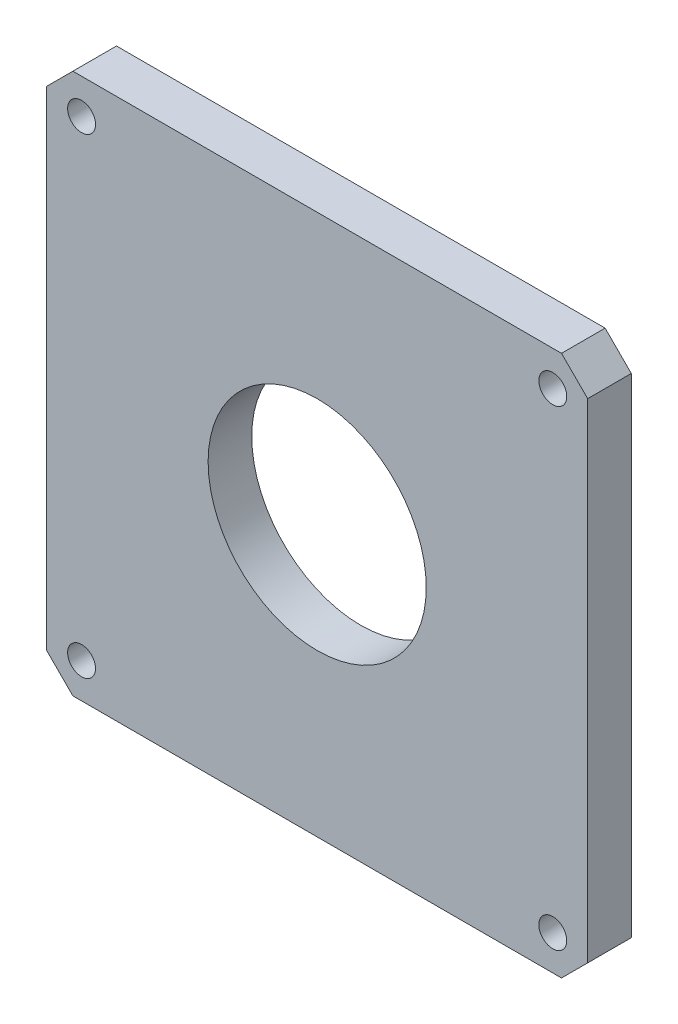
ISO-10303-21;
HEADER;
FILE_DESCRIPTION(('STEP AP214'),'2;1');
FILE_NAME('part.step','',(''),(''),'','','');
FILE_SCHEMA(('AUTOMOTIVE_DESIGN { 1 0 10303 214 1 1 1 1 }'));
ENDSEC;
DATA;
#1=APPLICATION_CONTEXT('core data for automotive mechanical design processes');
#2=APPLICATION_PROTOCOL_DEFINITION('international standard','automotive_design',2000,#1);
#3=PRODUCT_CONTEXT('',#1,'mechanical');
#4=PRODUCT('Part','Part','',(#3));
#5=PRODUCT_RELATED_PRODUCT_CATEGORY('part','',(#4));
#6=PRODUCT_DEFINITION_FORMATION('','',#4);
#7=PRODUCT_DEFINITION_CONTEXT('part definition',#1,'design');
#8=PRODUCT_DEFINITION('design','',#6,#7);
#9=PRODUCT_DEFINITION_SHAPE('','',#8);
#10=(LENGTH_UNIT() NAMED_UNIT(*) SI_UNIT(.MILLI.,.METRE.));
#11=(NAMED_UNIT(*) PLANE_ANGLE_UNIT() SI_UNIT($,.RADIAN.));
#12=(NAMED_UNIT(*) SI_UNIT($,.STERADIAN.) SOLID_ANGLE_UNIT());
#13=UNCERTAINTY_MEASURE_WITH_UNIT(LENGTH_MEASURE(1.E-05),#10,'distance_accuracy_value','');
#14=(GEOMETRIC_REPRESENTATION_CONTEXT(3) GLOBAL_UNCERTAINTY_ASSIGNED_CONTEXT((#13)) GLOBAL_UNIT_ASSIGNED_CONTEXT((#10,
#11,#12)) REPRESENTATION_CONTEXT('',''));
#15=CARTESIAN_POINT('',(0.,0.,0.));
#16=DIRECTION('',(0.,0.,1.));
#17=DIRECTION('',(1.,0.,0.));
#18=AXIS2_PLACEMENT_3D('',#15,#16,#17);
#19=CARTESIAN_POINT('',(0.,0.,5.));
#20=DIRECTION('',(0.,0.,1.));
#21=DIRECTION('',(1.,0.,0.));
#22=AXIS2_PLACEMENT_3D('',#19,#20,#21);
#23=PLANE('',#22);
#24=CARTESIAN_POINT('',(-27.,27.,5.));
#25=DIRECTION('',(0.,0.,1.));
#26=DIRECTION('',(-1.,0.,0.));
#27=AXIS2_PLACEMENT_3D('',#24,#25,#26);
#28=CIRCLE('',#27,1.6);
#29=CARTESIAN_POINT('',(-28.6,27.,5.));
#30=VERTEX_POINT('',#29);
#31=EDGE_CURVE('E193',#30,#30,#28,.T.);
#32=ORIENTED_EDGE('',*,*,#31,.F.);
#33=EDGE_LOOP('',(#32));
#34=FACE_BOUND('',#33,.T.);
#35=CARTESIAN_POINT('',(27.,-27.,5.));
#36=DIRECTION('',(0.,0.,1.));
#37=DIRECTION('',(-1.,0.,0.));
#38=AXIS2_PLACEMENT_3D('',#35,#36,#37);
#39=CIRCLE('',#38,1.6);
#40=CARTESIAN_POINT('',(25.4,-27.,5.));
#41=VERTEX_POINT('',#40);
#42=EDGE_CURVE('E199',#41,#41,#39,.T.);
#43=ORIENTED_EDGE('',*,*,#42,.F.);
#44=EDGE_LOOP('',(#43));
#45=FACE_BOUND('',#44,.T.);
#46=CARTESIAN_POINT('',(-27.,-27.,5.));
#47=DIRECTION('',(0.,0.,1.));
#48=DIRECTION('',(1.,0.,0.));
#49=AXIS2_PLACEMENT_3D('',#46,#47,#48);
#50=CIRCLE('',#49,1.6);
#51=CARTESIAN_POINT('',(-25.4,-27.,5.));
#52=VERTEX_POINT('',#51);
#53=EDGE_CURVE('E200',#52,#52,#50,.T.);
#54=ORIENTED_EDGE('',*,*,#53,.F.);
#55=EDGE_LOOP('',(#54));
#56=FACE_BOUND('',#55,.T.);
#57=CARTESIAN_POINT('',(27.,27.,5.));
#58=DIRECTION('',(0.,0.,1.));
#59=DIRECTION('',(1.,0.,0.));
#60=AXIS2_PLACEMENT_3D('',#57,#58,#59);
#61=CIRCLE('',#60,1.6);
#62=CARTESIAN_POINT('',(28.6,27.,5.));
#63=VERTEX_POINT('',#62);
#64=EDGE_CURVE('E190',#63,#63,#61,.T.);
#65=ORIENTED_EDGE('',*,*,#64,.F.);
#66=EDGE_LOOP('',(#65));
#67=FACE_BOUND('',#66,.T.);
#68=DIRECTION('',(1.,0.,0.));
#69=VECTOR('',#68,1.);
#70=CARTESIAN_POINT('',(-31.,-31.,5.));
#71=LINE('',#70,#69);
#72=CARTESIAN_POINT('',(-28.,-31.,5.));
#73=VERTEX_POINT('',#72);
#74=CARTESIAN_POINT('',(28.,-31.,5.));
#75=VERTEX_POINT('',#74);
#76=EDGE_CURVE('E174',#73,#75,#71,.T.);
#77=ORIENTED_EDGE('',*,*,#76,.T.);
#78=DIRECTION('',(-0.707106781186548,-0.707106781186547,0.));
#79=VECTOR('',#78,1.);
#80=CARTESIAN_POINT('',(29.5,-29.5,5.));
#81=LINE('',#80,#79);
#82=CARTESIAN_POINT('',(31.,-28.,5.));
#83=VERTEX_POINT('',#82);
#84=EDGE_CURVE('E155',#75,#83,#81,.F.);
#85=ORIENTED_EDGE('',*,*,#84,.T.);
#86=DIRECTION('',(0.,1.,0.));
#87=VECTOR('',#86,1.);
#88=CARTESIAN_POINT('',(31.,31.,5.));
#89=LINE('',#88,#87);
#90=CARTESIAN_POINT('',(31.,28.,5.));
#91=VERTEX_POINT('',#90);
#92=EDGE_CURVE('E125',#83,#91,#89,.T.);
#93=ORIENTED_EDGE('',*,*,#92,.T.);
#94=DIRECTION('',(0.707106781186547,-0.707106781186548,0.));
#95=VECTOR('',#94,1.);
#96=CARTESIAN_POINT('',(29.5,29.5,5.));
#97=LINE('',#96,#95);
#98=CARTESIAN_POINT('',(28.,31.,5.));
#99=VERTEX_POINT('',#98);
#100=EDGE_CURVE('E61',#91,#99,#97,.F.);
#101=ORIENTED_EDGE('',*,*,#100,.T.);
#102=DIRECTION('',(-1.,0.,0.));
#103=VECTOR('',#102,1.);
#104=CARTESIAN_POINT('',(-31.,31.,5.));
#105=LINE('',#104,#103);
#106=CARTESIAN_POINT('',(-28.,31.,5.));
#107=VERTEX_POINT('',#106);
#108=EDGE_CURVE('E141',#99,#107,#105,.T.);
#109=ORIENTED_EDGE('',*,*,#108,.T.);
#110=DIRECTION('',(0.707106781186548,0.707106781186547,0.));
#111=VECTOR('',#110,1.);
#112=CARTESIAN_POINT('',(-29.5,29.5,5.));
#113=LINE('',#112,#111);
#114=CARTESIAN_POINT('',(-31.,28.,5.));
#115=VERTEX_POINT('',#114);
#116=EDGE_CURVE('E152',#107,#115,#113,.F.);
#117=ORIENTED_EDGE('',*,*,#116,.T.);
#118=DIRECTION('',(0.,-1.,0.));
#119=VECTOR('',#118,1.);
#120=CARTESIAN_POINT('',(-31.,31.,5.));
#121=LINE('',#120,#119);
#122=CARTESIAN_POINT('',(-31.,-28.,5.));
#123=VERTEX_POINT('',#122);
#124=EDGE_CURVE('E135',#115,#123,#121,.T.);
#125=ORIENTED_EDGE('',*,*,#124,.T.);
#126=DIRECTION('',(-0.707106781186547,0.707106781186548,0.));
#127=VECTOR('',#126,1.);
#128=CARTESIAN_POINT('',(-29.5,-29.5,5.));
#129=LINE('',#128,#127);
#130=EDGE_CURVE('E150',#123,#73,#129,.F.);
#131=ORIENTED_EDGE('',*,*,#130,.T.);
#132=EDGE_LOOP('',(#77,#85,#93,#101,#109,#117,#125,#131));
#133=FACE_BOUND('',#132,.T.);
#134=CARTESIAN_POINT('',(0.,0.,5.));
#135=DIRECTION('',(0.,0.,1.));
#136=DIRECTION('',(1.,0.,0.));
#137=AXIS2_PLACEMENT_3D('',#134,#135,#136);
#138=CIRCLE('',#137,12.5);
#139=CARTESIAN_POINT('',(12.5,0.,5.));
#140=VERTEX_POINT('',#139);
#141=EDGE_CURVE('E179',#140,#140,#138,.T.);
#142=ORIENTED_EDGE('',*,*,#141,.F.);
#143=EDGE_LOOP('',(#142));
#144=FACE_BOUND('',#143,.T.);
#145=ADVANCED_FACE('F38',(#34,#45,#56,#67,#133,#144),#23,.T.);
#146=CARTESIAN_POINT('',(0.,0.,0.));
#147=DIRECTION('',(0.,0.,1.));
#148=DIRECTION('',(1.,0.,0.));
#149=AXIS2_PLACEMENT_3D('',#146,#147,#148);
#150=PLANE('',#149);
#151=CARTESIAN_POINT('',(-27.,27.,0.));
#152=DIRECTION('',(0.,0.,1.));
#153=DIRECTION('',(-1.,0.,0.));
#154=AXIS2_PLACEMENT_3D('',#151,#152,#153);
#155=CIRCLE('',#154,1.6);
#156=CARTESIAN_POINT('',(-28.6,27.,0.));
#157=VERTEX_POINT('',#156);
#158=EDGE_CURVE('E203',#157,#157,#155,.T.);
#159=ORIENTED_EDGE('',*,*,#158,.T.);
#160=EDGE_LOOP('',(#159));
#161=FACE_BOUND('',#160,.T.);
#162=CARTESIAN_POINT('',(27.,-27.,0.));
#163=DIRECTION('',(0.,0.,1.));
#164=DIRECTION('',(-1.,0.,0.));
#165=AXIS2_PLACEMENT_3D('',#162,#163,#164);
#166=CIRCLE('',#165,1.6);
#167=CARTESIAN_POINT('',(25.4,-27.,0.));
#168=VERTEX_POINT('',#167);
#169=EDGE_CURVE('E196',#168,#168,#166,.T.);
#170=ORIENTED_EDGE('',*,*,#169,.T.);
#171=EDGE_LOOP('',(#170));
#172=FACE_BOUND('',#171,.T.);
#173=CARTESIAN_POINT('',(-27.,-27.,0.));
#174=DIRECTION('',(0.,0.,1.));
#175=DIRECTION('',(1.,0.,0.));
#176=AXIS2_PLACEMENT_3D('',#173,#174,#175);
#177=CIRCLE('',#176,1.6);
#178=CARTESIAN_POINT('',(-25.4,-27.,0.));
#179=VERTEX_POINT('',#178);
#180=EDGE_CURVE('E208',#179,#179,#177,.T.);
#181=ORIENTED_EDGE('',*,*,#180,.T.);
#182=EDGE_LOOP('',(#181));
#183=FACE_BOUND('',#182,.T.);
#184=CARTESIAN_POINT('',(27.,27.,0.));
#185=DIRECTION('',(0.,0.,1.));
#186=DIRECTION('',(1.,0.,0.));
#187=AXIS2_PLACEMENT_3D('',#184,#185,#186);
#188=CIRCLE('',#187,1.6);
#189=CARTESIAN_POINT('',(28.6,27.,0.));
#190=VERTEX_POINT('',#189);
#191=EDGE_CURVE('E188',#190,#190,#188,.T.);
#192=ORIENTED_EDGE('',*,*,#191,.T.);
#193=EDGE_LOOP('',(#192));
#194=FACE_BOUND('',#193,.T.);
#195=DIRECTION('',(0.,1.,0.));
#196=VECTOR('',#195,1.);
#197=CARTESIAN_POINT('',(31.,31.,0.));
#198=LINE('',#197,#196);
#199=CARTESIAN_POINT('',(31.,-28.,0.));
#200=VERTEX_POINT('',#199);
#201=CARTESIAN_POINT('',(31.,28.,0.));
#202=VERTEX_POINT('',#201);
#203=EDGE_CURVE('E123',#200,#202,#198,.T.);
#204=ORIENTED_EDGE('',*,*,#203,.F.);
#205=DIRECTION('',(0.707106781186548,0.707106781186547,0.));
#206=VECTOR('',#205,1.);
#207=CARTESIAN_POINT('',(31.,-28.,0.));
#208=LINE('',#207,#206);
#209=CARTESIAN_POINT('',(28.,-31.,0.));
#210=VERTEX_POINT('',#209);
#211=EDGE_CURVE('E106',#200,#210,#208,.F.);
#212=ORIENTED_EDGE('',*,*,#211,.T.);
#213=DIRECTION('',(1.,0.,0.));
#214=VECTOR('',#213,1.);
#215=CARTESIAN_POINT('',(-31.,-31.,0.));
#216=LINE('',#215,#214);
#217=CARTESIAN_POINT('',(-28.,-31.,0.));
#218=VERTEX_POINT('',#217);
#219=EDGE_CURVE('E133',#218,#210,#216,.T.);
#220=ORIENTED_EDGE('',*,*,#219,.F.);
#221=DIRECTION('',(0.707106781186547,-0.707106781186548,0.));
#222=VECTOR('',#221,1.);
#223=CARTESIAN_POINT('',(-28.,-31.,0.));
#224=LINE('',#223,#222);
#225=CARTESIAN_POINT('',(-31.,-28.,0.));
#226=VERTEX_POINT('',#225);
#227=EDGE_CURVE('E126',#218,#226,#224,.F.);
#228=ORIENTED_EDGE('',*,*,#227,.T.);
#229=DIRECTION('',(0.,-1.,0.));
#230=VECTOR('',#229,1.);
#231=CARTESIAN_POINT('',(-31.,31.,0.));
#232=LINE('',#231,#230);
#233=CARTESIAN_POINT('',(-31.,28.,0.));
#234=VERTEX_POINT('',#233);
#235=EDGE_CURVE('E137',#234,#226,#232,.T.);
#236=ORIENTED_EDGE('',*,*,#235,.F.);
#237=DIRECTION('',(-0.707106781186548,-0.707106781186547,0.));
#238=VECTOR('',#237,1.);
#239=CARTESIAN_POINT('',(-31.,28.,0.));
#240=LINE('',#239,#238);
#241=CARTESIAN_POINT('',(-28.,31.,0.));
#242=VERTEX_POINT('',#241);
#243=EDGE_CURVE('E144',#234,#242,#240,.F.);
#244=ORIENTED_EDGE('',*,*,#243,.T.);
#245=DIRECTION('',(-1.,0.,0.));
#246=VECTOR('',#245,1.);
#247=CARTESIAN_POINT('',(-31.,31.,0.));
#248=LINE('',#247,#246);
#249=CARTESIAN_POINT('',(28.,31.,0.));
#250=VERTEX_POINT('',#249);
#251=EDGE_CURVE('E132',#250,#242,#248,.T.);
#252=ORIENTED_EDGE('',*,*,#251,.F.);
#253=DIRECTION('',(-0.707106781186547,0.707106781186548,0.));
#254=VECTOR('',#253,1.);
#255=CARTESIAN_POINT('',(28.,31.,0.));
#256=LINE('',#255,#254);
#257=EDGE_CURVE('E117',#250,#202,#256,.F.);
#258=ORIENTED_EDGE('',*,*,#257,.T.);
#259=EDGE_LOOP('',(#204,#212,#220,#228,#236,#244,#252,#258));
#260=FACE_BOUND('',#259,.T.);
#261=CARTESIAN_POINT('',(0.,0.,0.));
#262=DIRECTION('',(0.,0.,1.));
#263=DIRECTION('',(1.,0.,0.));
#264=AXIS2_PLACEMENT_3D('',#261,#262,#263);
#265=CIRCLE('',#264,12.5);
#266=CARTESIAN_POINT('',(12.5,0.,0.));
#267=VERTEX_POINT('',#266);
#268=EDGE_CURVE('E181',#267,#267,#265,.T.);
#269=ORIENTED_EDGE('',*,*,#268,.T.);
#270=EDGE_LOOP('',(#269));
#271=FACE_BOUND('',#270,.T.);
#272=ADVANCED_FACE('F129',(#161,#172,#183,#194,#260,#271),#150,.F.);
#273=CARTESIAN_POINT('',(-31.,31.,5.));
#274=DIRECTION('',(1.,0.,0.));
#275=DIRECTION('',(0.,0.,-1.));
#276=AXIS2_PLACEMENT_3D('',#273,#274,#275);
#277=PLANE('',#276);
#278=ORIENTED_EDGE('',*,*,#124,.F.);
#279=DIRECTION('',(0.,0.,-1.));
#280=VECTOR('',#279,1.);
#281=CARTESIAN_POINT('',(-31.,28.,5.));
#282=LINE('',#281,#280);
#283=EDGE_CURVE('E11',#115,#234,#282,.T.);
#284=ORIENTED_EDGE('',*,*,#283,.T.);
#285=ORIENTED_EDGE('',*,*,#235,.T.);
#286=DIRECTION('',(0.,0.,1.));
#287=VECTOR('',#286,1.);
#288=CARTESIAN_POINT('',(-31.,-28.,5.));
#289=LINE('',#288,#287);
#290=EDGE_CURVE('E47',#226,#123,#289,.T.);
#291=ORIENTED_EDGE('',*,*,#290,.T.);
#292=EDGE_LOOP('',(#278,#284,#285,#291));
#293=FACE_BOUND('',#292,.T.);
#294=ADVANCED_FACE('F165',(#293),#277,.F.);
#295=CARTESIAN_POINT('',(-31.,-31.,5.));
#296=DIRECTION('',(0.,1.,0.));
#297=DIRECTION('',(0.,0.,1.));
#298=AXIS2_PLACEMENT_3D('',#295,#296,#297);
#299=PLANE('',#298);
#300=ORIENTED_EDGE('',*,*,#219,.T.);
#301=DIRECTION('',(0.,0.,1.));
#302=VECTOR('',#301,1.);
#303=CARTESIAN_POINT('',(28.,-31.,5.));
#304=LINE('',#303,#302);
#305=EDGE_CURVE('E111',#210,#75,#304,.T.);
#306=ORIENTED_EDGE('',*,*,#305,.T.);
#307=ORIENTED_EDGE('',*,*,#76,.F.);
#308=DIRECTION('',(0.,0.,-1.));
#309=VECTOR('',#308,1.);
#310=CARTESIAN_POINT('',(-28.,-31.,5.));
#311=LINE('',#310,#309);
#312=EDGE_CURVE('E116',#73,#218,#311,.T.);
#313=ORIENTED_EDGE('',*,*,#312,.T.);
#314=EDGE_LOOP('',(#300,#306,#307,#313));
#315=FACE_BOUND('',#314,.T.);
#316=ADVANCED_FACE('F178',(#315),#299,.F.);
#317=CARTESIAN_POINT('',(31.,31.,5.));
#318=DIRECTION('',(-1.,0.,0.));
#319=DIRECTION('',(0.,0.,1.));
#320=AXIS2_PLACEMENT_3D('',#317,#318,#319);
#321=PLANE('',#320);
#322=ORIENTED_EDGE('',*,*,#92,.F.);
#323=DIRECTION('',(0.,0.,-1.));
#324=VECTOR('',#323,1.);
#325=CARTESIAN_POINT('',(31.,-28.,5.));
#326=LINE('',#325,#324);
#327=EDGE_CURVE('E110',#83,#200,#326,.T.);
#328=ORIENTED_EDGE('',*,*,#327,.T.);
#329=ORIENTED_EDGE('',*,*,#203,.T.);
#330=DIRECTION('',(0.,0.,1.));
#331=VECTOR('',#330,1.);
#332=CARTESIAN_POINT('',(31.,28.,5.));
#333=LINE('',#332,#331);
#334=EDGE_CURVE('E127',#202,#91,#333,.T.);
#335=ORIENTED_EDGE('',*,*,#334,.T.);
#336=EDGE_LOOP('',(#322,#328,#329,#335));
#337=FACE_BOUND('',#336,.T.);
#338=ADVANCED_FACE('F122',(#337),#321,.F.);
#339=CARTESIAN_POINT('',(-31.,31.,5.));
#340=DIRECTION('',(0.,-1.,0.));
#341=DIRECTION('',(0.,0.,-1.));
#342=AXIS2_PLACEMENT_3D('',#339,#340,#341);
#343=PLANE('',#342);
#344=ORIENTED_EDGE('',*,*,#108,.F.);
#345=DIRECTION('',(0.,0.,-1.));
#346=VECTOR('',#345,1.);
#347=CARTESIAN_POINT('',(28.,31.,5.));
#348=LINE('',#347,#346);
#349=EDGE_CURVE('E158',#99,#250,#348,.T.);
#350=ORIENTED_EDGE('',*,*,#349,.T.);
#351=ORIENTED_EDGE('',*,*,#251,.T.);
#352=DIRECTION('',(0.,0.,1.));
#353=VECTOR('',#352,1.);
#354=CARTESIAN_POINT('',(-28.,31.,5.));
#355=LINE('',#354,#353);
#356=EDGE_CURVE('E54',#242,#107,#355,.T.);
#357=ORIENTED_EDGE('',*,*,#356,.T.);
#358=EDGE_LOOP('',(#344,#350,#351,#357));
#359=FACE_BOUND('',#358,.T.);
#360=ADVANCED_FACE('F240',(#359),#343,.F.);
#361=CARTESIAN_POINT('',(0.,0.,5.));
#362=DIRECTION('',(0.,0.,-1.));
#363=DIRECTION('',(-1.,0.,0.));
#364=AXIS2_PLACEMENT_3D('',#361,#362,#363);
#365=CYLINDRICAL_SURFACE('',#364,12.5);
#366=ORIENTED_EDGE('',*,*,#141,.T.);
#367=EDGE_LOOP('',(#366));
#368=FACE_BOUND('',#367,.T.);
#369=ORIENTED_EDGE('',*,*,#268,.F.);
#370=EDGE_LOOP('',(#369));
#371=FACE_BOUND('',#370,.T.);
#372=ADVANCED_FACE('F238',(#368,#371),#365,.F.);
#373=CARTESIAN_POINT('',(31.,-28.,5.));
#374=DIRECTION('',(-0.707106781186547,0.707106781186548,0.));
#375=DIRECTION('',(0.,0.,-1.));
#376=AXIS2_PLACEMENT_3D('',#373,#374,#375);
#377=PLANE('',#376);
#378=ORIENTED_EDGE('',*,*,#84,.F.);
#379=ORIENTED_EDGE('',*,*,#305,.F.);
#380=ORIENTED_EDGE('',*,*,#211,.F.);
#381=ORIENTED_EDGE('',*,*,#327,.F.);
#382=EDGE_LOOP('',(#378,#379,#380,#381));
#383=FACE_BOUND('',#382,.T.);
#384=ADVANCED_FACE('F109',(#383),#377,.F.);
#385=CARTESIAN_POINT('',(28.,31.,5.));
#386=DIRECTION('',(-0.707106781186548,-0.707106781186547,0.));
#387=DIRECTION('',(0.,0.,-1.));
#388=AXIS2_PLACEMENT_3D('',#385,#386,#387);
#389=PLANE('',#388);
#390=ORIENTED_EDGE('',*,*,#100,.F.);
#391=ORIENTED_EDGE('',*,*,#334,.F.);
#392=ORIENTED_EDGE('',*,*,#257,.F.);
#393=ORIENTED_EDGE('',*,*,#349,.F.);
#394=EDGE_LOOP('',(#390,#391,#392,#393));
#395=FACE_BOUND('',#394,.T.);
#396=ADVANCED_FACE('F260',(#395),#389,.F.);
#397=CARTESIAN_POINT('',(-31.,28.,5.));
#398=DIRECTION('',(0.707106781186547,-0.707106781186548,0.));
#399=DIRECTION('',(0.,0.,-1.));
#400=AXIS2_PLACEMENT_3D('',#397,#398,#399);
#401=PLANE('',#400);
#402=ORIENTED_EDGE('',*,*,#116,.F.);
#403=ORIENTED_EDGE('',*,*,#356,.F.);
#404=ORIENTED_EDGE('',*,*,#243,.F.);
#405=ORIENTED_EDGE('',*,*,#283,.F.);
#406=EDGE_LOOP('',(#402,#403,#404,#405));
#407=FACE_BOUND('',#406,.T.);
#408=ADVANCED_FACE('F233',(#407),#401,.F.);
#409=CARTESIAN_POINT('',(-28.,-31.,5.));
#410=DIRECTION('',(0.707106781186548,0.707106781186547,0.));
#411=DIRECTION('',(0.,0.,-1.));
#412=AXIS2_PLACEMENT_3D('',#409,#410,#411);
#413=PLANE('',#412);
#414=ORIENTED_EDGE('',*,*,#130,.F.);
#415=ORIENTED_EDGE('',*,*,#290,.F.);
#416=ORIENTED_EDGE('',*,*,#227,.F.);
#417=ORIENTED_EDGE('',*,*,#312,.F.);
#418=EDGE_LOOP('',(#414,#415,#416,#417));
#419=FACE_BOUND('',#418,.T.);
#420=ADVANCED_FACE('F41',(#419),#413,.F.);
#421=CARTESIAN_POINT('',(27.,27.,0.));
#422=DIRECTION('',(0.,0.,1.));
#423=DIRECTION('',(1.,0.,0.));
#424=AXIS2_PLACEMENT_3D('',#421,#422,#423);
#425=CYLINDRICAL_SURFACE('',#424,1.6);
#426=ORIENTED_EDGE('',*,*,#191,.F.);
#427=EDGE_LOOP('',(#426));
#428=FACE_BOUND('',#427,.T.);
#429=ORIENTED_EDGE('',*,*,#64,.T.);
#430=EDGE_LOOP('',(#429));
#431=FACE_BOUND('',#430,.T.);
#432=ADVANCED_FACE('F222',(#428,#431),#425,.F.);
#433=CARTESIAN_POINT('',(-27.,-27.,0.));
#434=DIRECTION('',(0.,0.,1.));
#435=DIRECTION('',(1.,0.,0.));
#436=AXIS2_PLACEMENT_3D('',#433,#434,#435);
#437=CYLINDRICAL_SURFACE('',#436,1.6);
#438=ORIENTED_EDGE('',*,*,#180,.F.);
#439=EDGE_LOOP('',(#438));
#440=FACE_BOUND('',#439,.T.);
#441=ORIENTED_EDGE('',*,*,#53,.T.);
#442=EDGE_LOOP('',(#441));
#443=FACE_BOUND('',#442,.T.);
#444=ADVANCED_FACE('F214',(#440,#443),#437,.F.);
#445=CARTESIAN_POINT('',(27.,-27.,0.));
#446=DIRECTION('',(0.,0.,1.));
#447=DIRECTION('',(1.,0.,0.));
#448=AXIS2_PLACEMENT_3D('',#445,#446,#447);
#449=CYLINDRICAL_SURFACE('',#448,1.6);
#450=ORIENTED_EDGE('',*,*,#169,.F.);
#451=EDGE_LOOP('',(#450));
#452=FACE_BOUND('',#451,.T.);
#453=ORIENTED_EDGE('',*,*,#42,.T.);
#454=EDGE_LOOP('',(#453));
#455=FACE_BOUND('',#454,.T.);
#456=ADVANCED_FACE('F230',(#452,#455),#449,.F.);
#457=CARTESIAN_POINT('',(-27.,27.,0.));
#458=DIRECTION('',(0.,0.,1.));
#459=DIRECTION('',(1.,0.,0.));
#460=AXIS2_PLACEMENT_3D('',#457,#458,#459);
#461=CYLINDRICAL_SURFACE('',#460,1.6);
#462=ORIENTED_EDGE('',*,*,#158,.F.);
#463=EDGE_LOOP('',(#462));
#464=FACE_BOUND('',#463,.T.);
#465=ORIENTED_EDGE('',*,*,#31,.T.);
#466=EDGE_LOOP('',(#465));
#467=FACE_BOUND('',#466,.T.);
#468=ADVANCED_FACE('F315',(#464,#467),#461,.F.);
#469=CLOSED_SHELL('',(#145,#272,#294,#316,#338,#360,#372,#384,#396,#408,#420,#432,#444,#456,#468));
#470=MANIFOLD_SOLID_BREP('B2',#469);
#471=ADVANCED_BREP_SHAPE_REPRESENTATION('',(#18,#470),#14);
#472=SHAPE_DEFINITION_REPRESENTATION(#9,#471);
ENDSEC;
END-ISO-10303-21;
